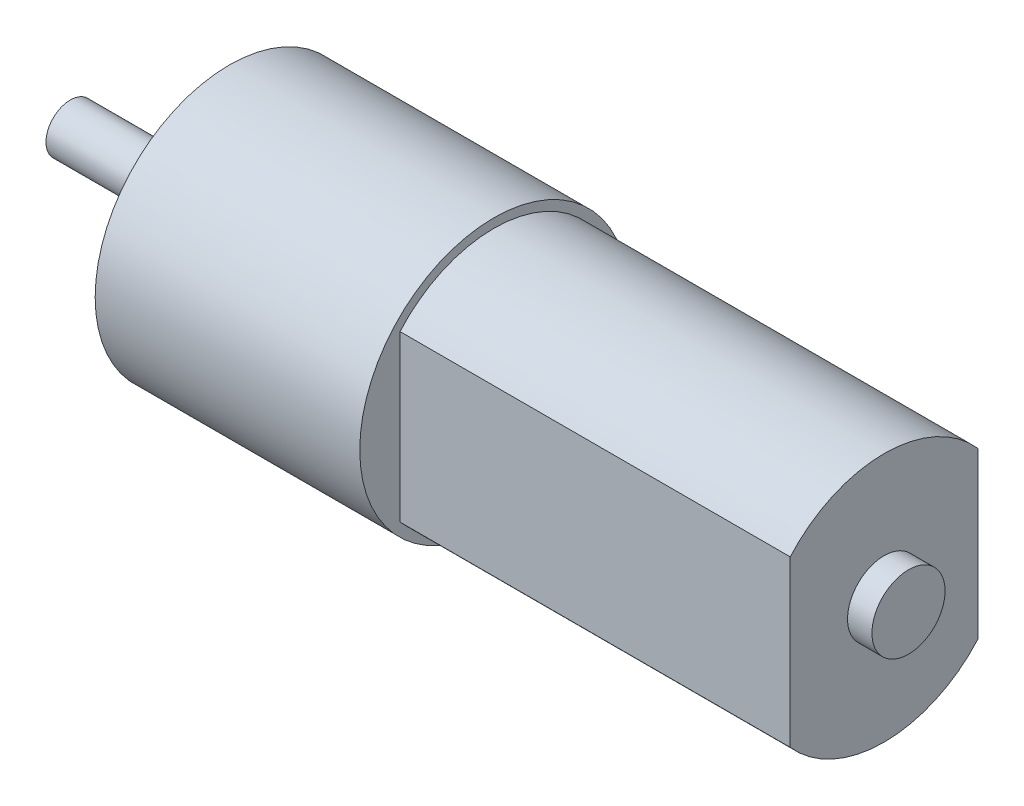
ISO-10303-21;
HEADER;
FILE_DESCRIPTION(('STEP AP214'),'2;1');
FILE_NAME('part.step','',(''),(''),'','','');
FILE_SCHEMA(('AUTOMOTIVE_DESIGN { 1 0 10303 214 1 1 1 1 }'));
ENDSEC;
DATA;
#1=APPLICATION_CONTEXT('core data for automotive mechanical design processes');
#2=APPLICATION_PROTOCOL_DEFINITION('international standard','automotive_design',2000,#1);
#3=PRODUCT_CONTEXT('',#1,'mechanical');
#4=PRODUCT('Part','Part','',(#3));
#5=PRODUCT_RELATED_PRODUCT_CATEGORY('part','',(#4));
#6=PRODUCT_DEFINITION_FORMATION('','',#4);
#7=PRODUCT_DEFINITION_CONTEXT('part definition',#1,'design');
#8=PRODUCT_DEFINITION('design','',#6,#7);
#9=PRODUCT_DEFINITION_SHAPE('','',#8);
#10=(LENGTH_UNIT() NAMED_UNIT(*) SI_UNIT(.MILLI.,.METRE.));
#11=(NAMED_UNIT(*) PLANE_ANGLE_UNIT() SI_UNIT($,.RADIAN.));
#12=(NAMED_UNIT(*) SI_UNIT($,.STERADIAN.) SOLID_ANGLE_UNIT());
#13=UNCERTAINTY_MEASURE_WITH_UNIT(LENGTH_MEASURE(1.E-05),#10,'distance_accuracy_value','');
#14=(GEOMETRIC_REPRESENTATION_CONTEXT(3) GLOBAL_UNCERTAINTY_ASSIGNED_CONTEXT((#13)) GLOBAL_UNIT_ASSIGNED_CONTEXT((#10,
#11,#12)) REPRESENTATION_CONTEXT('',''));
#15=CARTESIAN_POINT('',(0.,0.,0.));
#16=DIRECTION('',(0.,0.,1.));
#17=DIRECTION('',(1.,0.,0.));
#18=AXIS2_PLACEMENT_3D('',#15,#16,#17);
#19=CARTESIAN_POINT('',(38.7033994714384,0.,0.));
#20=DIRECTION('',(1.,0.,0.));
#21=DIRECTION('',(0.,0.,-1.));
#22=AXIS2_PLACEMENT_3D('',#19,#20,#21);
#23=CYLINDRICAL_SURFACE('',#22,7.00000000000001);
#24=CARTESIAN_POINT('',(-2.,0.,0.));
#25=DIRECTION('',(1.,0.,0.));
#26=DIRECTION('',(0.,0.,-1.));
#27=AXIS2_PLACEMENT_3D('',#24,#25,#26);
#28=CIRCLE('',#27,7.00000000000001);
#29=CARTESIAN_POINT('',(-2.,1.69313093032285,6.79215044391569));
#30=VERTEX_POINT('',#29);
#31=CARTESIAN_POINT('',(-2.,-6.79215044391568,-1.69313093032292));
#32=VERTEX_POINT('',#31);
#33=EDGE_CURVE('E119',#30,#32,#28,.T.);
#34=ORIENTED_EDGE('',*,*,#33,.T.);
#35=DIRECTION('',(-1.,0.,0.));
#36=VECTOR('',#35,1.);
#37=CARTESIAN_POINT('',(7.211102550928,-6.79215044391568,-1.69313093032292));
#38=LINE('',#37,#36);
#39=CARTESIAN_POINT('',(0.,-6.79215044391568,-1.69313093032292));
#40=VERTEX_POINT('',#39);
#41=EDGE_CURVE('E101',#40,#32,#38,.T.);
#42=ORIENTED_EDGE('',*,*,#41,.F.);
#43=CARTESIAN_POINT('',(0.,0.,0.));
#44=DIRECTION('',(1.,0.,0.));
#45=DIRECTION('',(0.,0.,-1.));
#46=AXIS2_PLACEMENT_3D('',#43,#44,#45);
#47=CIRCLE('',#46,7.00000000000001);
#48=CARTESIAN_POINT('',(0.,1.69313093032285,6.79215044391569));
#49=VERTEX_POINT('',#48);
#50=EDGE_CURVE('E120',#49,#40,#47,.T.);
#51=ORIENTED_EDGE('',*,*,#50,.F.);
#52=DIRECTION('',(-1.,0.,0.));
#53=VECTOR('',#52,1.);
#54=CARTESIAN_POINT('',(7.211102550928,1.69313093032285,6.79215044391569));
#55=LINE('',#54,#53);
#56=EDGE_CURVE('E175',#49,#30,#55,.T.);
#57=ORIENTED_EDGE('',*,*,#56,.T.);
#58=EDGE_LOOP('',(#34,#42,#51,#57));
#59=FACE_BOUND('',#58,.T.);
#60=ADVANCED_FACE('F32',(#59),#23,.T.);
#61=CARTESIAN_POINT('',(38.7033994714384,0.,0.));
#62=DIRECTION('',(1.,0.,0.));
#63=DIRECTION('',(0.,0.,-1.));
#64=AXIS2_PLACEMENT_3D('',#61,#62,#63);
#65=CYLINDRICAL_SURFACE('',#64,10.25);
#66=CARTESIAN_POINT('',(21.7,0.,0.));
#67=DIRECTION('',(1.,0.,0.));
#68=DIRECTION('',(0.,0.,-1.));
#69=AXIS2_PLACEMENT_3D('',#66,#67,#68);
#70=CIRCLE('',#69,10.25);
#71=CARTESIAN_POINT('',(21.7,-6.76553767264656,7.7));
#72=VERTEX_POINT('',#71);
#73=CARTESIAN_POINT('',(21.7,-6.76553767264656,-7.7));
#74=VERTEX_POINT('',#73);
#75=EDGE_CURVE('E158',#72,#74,#70,.T.);
#76=ORIENTED_EDGE('',*,*,#75,.T.);
#77=DIRECTION('',(1.,0.,0.));
#78=VECTOR('',#77,1.);
#79=CARTESIAN_POINT('',(38.7033994714384,-6.76553767264656,-7.7));
#80=LINE('',#79,#78);
#81=CARTESIAN_POINT('',(53.7,-6.76553767264656,-7.7));
#82=VERTEX_POINT('',#81);
#83=EDGE_CURVE('E155',#74,#82,#80,.T.);
#84=ORIENTED_EDGE('',*,*,#83,.T.);
#85=CARTESIAN_POINT('',(53.7,0.,0.));
#86=DIRECTION('',(1.,0.,0.));
#87=DIRECTION('',(0.,0.,-1.));
#88=AXIS2_PLACEMENT_3D('',#85,#86,#87);
#89=CIRCLE('',#88,10.25);
#90=CARTESIAN_POINT('',(53.7,-6.76553767264656,7.7));
#91=VERTEX_POINT('',#90);
#92=EDGE_CURVE('E142',#91,#82,#89,.T.);
#93=ORIENTED_EDGE('',*,*,#92,.F.);
#94=DIRECTION('',(1.,0.,0.));
#95=VECTOR('',#94,1.);
#96=CARTESIAN_POINT('',(38.7033994714384,-6.76553767264656,7.7));
#97=LINE('',#96,#95);
#98=EDGE_CURVE('E153',#91,#72,#97,.F.);
#99=ORIENTED_EDGE('',*,*,#98,.T.);
#100=EDGE_LOOP('',(#76,#84,#93,#99));
#101=FACE_BOUND('',#100,.T.);
#102=ADVANCED_FACE('F152',(#101),#65,.T.);
#103=CARTESIAN_POINT('',(-13.035736804533,0.,0.));
#104=DIRECTION('',(1.,0.,0.));
#105=DIRECTION('',(0.,0.,-1.));
#106=AXIS2_PLACEMENT_3D('',#103,#104,#105);
#107=PLANE('',#106);
#108=CARTESIAN_POINT('',(-13.035736804533,0.,0.));
#109=DIRECTION('',(1.,0.,0.));
#110=DIRECTION('',(0.,0.,-1.));
#111=AXIS2_PLACEMENT_3D('',#108,#109,#110);
#112=CIRCLE('',#111,2.00000000000001);
#113=CARTESIAN_POINT('',(-13.035736804533,0.,-2.00000000000001));
#114=VERTEX_POINT('',#113);
#115=EDGE_CURVE('E134',#114,#114,#112,.T.);
#116=ORIENTED_EDGE('',*,*,#115,.F.);
#117=EDGE_LOOP('',(#116));
#118=FACE_BOUND('',#117,.T.);
#119=ADVANCED_FACE('F34',(#118),#107,.F.);
#120=CARTESIAN_POINT('',(38.7033994714384,0.,0.));
#121=DIRECTION('',(1.,0.,0.));
#122=DIRECTION('',(0.,0.,-1.));
#123=AXIS2_PLACEMENT_3D('',#120,#121,#122);
#124=CYLINDRICAL_SURFACE('',#123,2.00000000000001);
#125=CARTESIAN_POINT('',(-3.,0.,0.));
#126=DIRECTION('',(1.,0.,0.));
#127=DIRECTION('',(0.,0.,-1.));
#128=AXIS2_PLACEMENT_3D('',#125,#126,#127);
#129=CIRCLE('',#128,2.00000000000001);
#130=CARTESIAN_POINT('',(-3.,0.,-2.00000000000001));
#131=VERTEX_POINT('',#130);
#132=EDGE_CURVE('E131',#131,#131,#129,.T.);
#133=ORIENTED_EDGE('',*,*,#132,.F.);
#134=EDGE_LOOP('',(#133));
#135=FACE_BOUND('',#134,.T.);
#136=ORIENTED_EDGE('',*,*,#115,.T.);
#137=EDGE_LOOP('',(#136));
#138=FACE_BOUND('',#137,.T.);
#139=ADVANCED_FACE('F239',(#135,#138),#124,.T.);
#140=CARTESIAN_POINT('',(-3.,-2.00000000000001,0.));
#141=DIRECTION('',(1.,0.,0.));
#142=DIRECTION('',(0.,0.,-1.));
#143=AXIS2_PLACEMENT_3D('',#140,#141,#142);
#144=PLANE('',#143);
#145=CARTESIAN_POINT('',(-3.,0.,0.));
#146=DIRECTION('',(1.,0.,0.));
#147=DIRECTION('',(0.,0.,-1.));
#148=AXIS2_PLACEMENT_3D('',#145,#146,#147);
#149=CIRCLE('',#148,4.00000000000001);
#150=CARTESIAN_POINT('',(-3.,0.,-4.00000000000001));
#151=VERTEX_POINT('',#150);
#152=EDGE_CURVE('E128',#151,#151,#149,.T.);
#153=ORIENTED_EDGE('',*,*,#152,.F.);
#154=EDGE_LOOP('',(#153));
#155=FACE_BOUND('',#154,.T.);
#156=ORIENTED_EDGE('',*,*,#132,.T.);
#157=EDGE_LOOP('',(#156));
#158=FACE_BOUND('',#157,.T.);
#159=ADVANCED_FACE('F234',(#155,#158),#144,.F.);
#160=CARTESIAN_POINT('',(38.7033994714384,0.,0.));
#161=DIRECTION('',(1.,0.,0.));
#162=DIRECTION('',(0.,0.,-1.));
#163=AXIS2_PLACEMENT_3D('',#160,#161,#162);
#164=CYLINDRICAL_SURFACE('',#163,4.00000000000001);
#165=CARTESIAN_POINT('',(-2.,0.,0.));
#166=DIRECTION('',(1.,0.,0.));
#167=DIRECTION('',(0.,0.,-1.));
#168=AXIS2_PLACEMENT_3D('',#165,#166,#167);
#169=CIRCLE('',#168,4.00000000000001);
#170=CARTESIAN_POINT('',(-2.,0.,-4.00000000000001));
#171=VERTEX_POINT('',#170);
#172=EDGE_CURVE('E122',#171,#171,#169,.T.);
#173=ORIENTED_EDGE('',*,*,#172,.F.);
#174=EDGE_LOOP('',(#173));
#175=FACE_BOUND('',#174,.T.);
#176=ORIENTED_EDGE('',*,*,#152,.T.);
#177=EDGE_LOOP('',(#176));
#178=FACE_BOUND('',#177,.T.);
#179=ADVANCED_FACE('F230',(#175,#178),#164,.T.);
#180=CARTESIAN_POINT('',(-2.,-4.00000000000001,0.));
#181=DIRECTION('',(1.,0.,0.));
#182=DIRECTION('',(0.,0.,-1.));
#183=AXIS2_PLACEMENT_3D('',#180,#181,#182);
#184=PLANE('',#183);
#185=CARTESIAN_POINT('',(-2.,-1.69313093032285,-6.79215044391569));
#186=VERTEX_POINT('',#185);
#187=CARTESIAN_POINT('',(-2.,6.79215044391567,1.69313093032292));
#188=VERTEX_POINT('',#187);
#189=EDGE_CURVE('E111',#186,#188,#28,.T.);
#190=ORIENTED_EDGE('',*,*,#189,.F.);
#191=DIRECTION('',(0.,0.707106781186551,-0.707106781186544));
#192=VECTOR('',#191,1.);
#193=CARTESIAN_POINT('',(-2.,-1.69313093032285,-6.79215044391569));
#194=LINE('',#193,#192);
#195=EDGE_CURVE('E95',#32,#186,#194,.T.);
#196=ORIENTED_EDGE('',*,*,#195,.F.);
#197=ORIENTED_EDGE('',*,*,#33,.F.);
#198=DIRECTION('',(0.,-0.707106781186551,0.707106781186544));
#199=VECTOR('',#198,1.);
#200=CARTESIAN_POINT('',(-2.,1.69313093032285,6.79215044391569));
#201=LINE('',#200,#199);
#202=EDGE_CURVE('E118',#188,#30,#201,.T.);
#203=ORIENTED_EDGE('',*,*,#202,.F.);
#204=EDGE_LOOP('',(#190,#196,#197,#203));
#205=FACE_BOUND('',#204,.T.);
#206=ORIENTED_EDGE('',*,*,#172,.T.);
#207=EDGE_LOOP('',(#206));
#208=FACE_BOUND('',#207,.T.);
#209=ADVANCED_FACE('F116',(#205,#208),#184,.F.);
#210=CARTESIAN_POINT('',(0.,-1.69313093032285,-6.79215044391569));
#211=VERTEX_POINT('',#210);
#212=CARTESIAN_POINT('',(0.,6.79215044391567,1.69313093032292));
#213=VERTEX_POINT('',#212);
#214=EDGE_CURVE('E113',#211,#213,#47,.T.);
#215=ORIENTED_EDGE('',*,*,#214,.F.);
#216=DIRECTION('',(-1.,0.,0.));
#217=VECTOR('',#216,1.);
#218=CARTESIAN_POINT('',(7.211102550928,-1.69313093032285,-6.79215044391569));
#219=LINE('',#218,#217);
#220=EDGE_CURVE('E98',#211,#186,#219,.T.);
#221=ORIENTED_EDGE('',*,*,#220,.T.);
#222=ORIENTED_EDGE('',*,*,#189,.T.);
#223=DIRECTION('',(-1.,0.,0.));
#224=VECTOR('',#223,1.);
#225=CARTESIAN_POINT('',(7.211102550928,6.79215044391567,1.69313093032292));
#226=LINE('',#225,#224);
#227=EDGE_CURVE('E173',#213,#188,#226,.T.);
#228=ORIENTED_EDGE('',*,*,#227,.F.);
#229=EDGE_LOOP('',(#215,#221,#222,#228));
#230=FACE_BOUND('',#229,.T.);
#231=ADVANCED_FACE('F109',(#230),#23,.T.);
#232=CARTESIAN_POINT('',(0.,-7.00000000000001,0.));
#233=DIRECTION('',(1.,0.,0.));
#234=DIRECTION('',(0.,0.,-1.));
#235=AXIS2_PLACEMENT_3D('',#232,#233,#234);
#236=PLANE('',#235);
#237=CARTESIAN_POINT('',(0.,0.,-9.));
#238=DIRECTION('',(-1.,0.,0.));
#239=DIRECTION('',(0.,0.,1.));
#240=AXIS2_PLACEMENT_3D('',#237,#238,#239);
#241=CIRCLE('',#240,1.);
#242=CARTESIAN_POINT('',(0.,0.,-8.));
#243=VERTEX_POINT('',#242);
#244=EDGE_CURVE('E460',#243,#243,#241,.T.);
#245=ORIENTED_EDGE('',*,*,#244,.F.);
#246=EDGE_LOOP('',(#245));
#247=FACE_BOUND('',#246,.T.);
#248=CARTESIAN_POINT('',(0.,-9.,0.));
#249=DIRECTION('',(-1.,0.,0.));
#250=DIRECTION('',(0.,0.,1.));
#251=AXIS2_PLACEMENT_3D('',#248,#249,#250);
#252=CIRCLE('',#251,1.);
#253=CARTESIAN_POINT('',(0.,-9.,1.));
#254=VERTEX_POINT('',#253);
#255=EDGE_CURVE('E470',#254,#254,#252,.T.);
#256=ORIENTED_EDGE('',*,*,#255,.F.);
#257=EDGE_LOOP('',(#256));
#258=FACE_BOUND('',#257,.T.);
#259=CARTESIAN_POINT('',(0.,0.,9.));
#260=DIRECTION('',(-1.,0.,0.));
#261=DIRECTION('',(0.,0.,1.));
#262=AXIS2_PLACEMENT_3D('',#259,#260,#261);
#263=CIRCLE('',#262,1.);
#264=CARTESIAN_POINT('',(0.,0.,10.));
#265=VERTEX_POINT('',#264);
#266=EDGE_CURVE('E476',#265,#265,#263,.T.);
#267=ORIENTED_EDGE('',*,*,#266,.F.);
#268=EDGE_LOOP('',(#267));
#269=FACE_BOUND('',#268,.T.);
#270=CARTESIAN_POINT('',(0.,9.,0.));
#271=DIRECTION('',(-1.,0.,0.));
#272=DIRECTION('',(0.,0.,1.));
#273=AXIS2_PLACEMENT_3D('',#270,#271,#272);
#274=CIRCLE('',#273,1.);
#275=CARTESIAN_POINT('',(0.,9.,1.));
#276=VERTEX_POINT('',#275);
#277=EDGE_CURVE('E459',#276,#276,#274,.T.);
#278=ORIENTED_EDGE('',*,*,#277,.F.);
#279=EDGE_LOOP('',(#278));
#280=FACE_BOUND('',#279,.T.);
#281=CARTESIAN_POINT('',(0.,0.,0.));
#282=DIRECTION('',(1.,0.,0.));
#283=DIRECTION('',(0.,0.,-1.));
#284=AXIS2_PLACEMENT_3D('',#281,#282,#283);
#285=CIRCLE('',#284,11.);
#286=CARTESIAN_POINT('',(0.,0.,-11.));
#287=VERTEX_POINT('',#286);
#288=EDGE_CURVE('E166',#287,#287,#285,.T.);
#289=ORIENTED_EDGE('',*,*,#288,.F.);
#290=EDGE_LOOP('',(#289));
#291=FACE_BOUND('',#290,.T.);
#292=ORIENTED_EDGE('',*,*,#50,.T.);
#293=DIRECTION('',(0.,0.707106781186551,-0.707106781186544));
#294=VECTOR('',#293,1.);
#295=CARTESIAN_POINT('',(0.,-1.69313093032285,-6.79215044391569));
#296=LINE('',#295,#294);
#297=EDGE_CURVE('E47',#40,#211,#296,.T.);
#298=ORIENTED_EDGE('',*,*,#297,.T.);
#299=ORIENTED_EDGE('',*,*,#214,.T.);
#300=DIRECTION('',(0.,-0.707106781186551,0.707106781186544));
#301=VECTOR('',#300,1.);
#302=CARTESIAN_POINT('',(0.,1.69313093032285,6.79215044391569));
#303=LINE('',#302,#301);
#304=EDGE_CURVE('E52',#213,#49,#303,.T.);
#305=ORIENTED_EDGE('',*,*,#304,.T.);
#306=EDGE_LOOP('',(#292,#298,#299,#305));
#307=FACE_BOUND('',#306,.T.);
#308=ADVANCED_FACE('F170',(#247,#258,#269,#280,#291,#307),#236,.F.);
#309=CARTESIAN_POINT('',(38.7033994714384,0.,0.));
#310=DIRECTION('',(1.,0.,0.));
#311=DIRECTION('',(0.,0.,-1.));
#312=AXIS2_PLACEMENT_3D('',#309,#310,#311);
#313=CYLINDRICAL_SURFACE('',#312,11.);
#314=CARTESIAN_POINT('',(21.7,0.,0.));
#315=DIRECTION('',(1.,0.,0.));
#316=DIRECTION('',(0.,0.,-1.));
#317=AXIS2_PLACEMENT_3D('',#314,#315,#316);
#318=CIRCLE('',#317,11.);
#319=CARTESIAN_POINT('',(21.7,0.,-11.));
#320=VERTEX_POINT('',#319);
#321=EDGE_CURVE('E164',#320,#320,#318,.T.);
#322=ORIENTED_EDGE('',*,*,#321,.F.);
#323=EDGE_LOOP('',(#322));
#324=FACE_BOUND('',#323,.T.);
#325=ORIENTED_EDGE('',*,*,#288,.T.);
#326=EDGE_LOOP('',(#325));
#327=FACE_BOUND('',#326,.T.);
#328=ADVANCED_FACE('F228',(#324,#327),#313,.T.);
#329=CARTESIAN_POINT('',(21.7,-11.,0.));
#330=DIRECTION('',(-1.,0.,0.));
#331=DIRECTION('',(0.,0.,1.));
#332=AXIS2_PLACEMENT_3D('',#329,#330,#331);
#333=PLANE('',#332);
#334=DIRECTION('',(0.,-1.,0.));
#335=VECTOR('',#334,1.);
#336=CARTESIAN_POINT('',(21.7,-12.1760425529863,-7.7));
#337=LINE('',#336,#335);
#338=CARTESIAN_POINT('',(21.7,6.76553767264656,-7.7));
#339=VERTEX_POINT('',#338);
#340=EDGE_CURVE('E178',#339,#74,#337,.T.);
#341=ORIENTED_EDGE('',*,*,#340,.T.);
#342=ORIENTED_EDGE('',*,*,#75,.F.);
#343=DIRECTION('',(0.,1.,0.));
#344=VECTOR('',#343,1.);
#345=CARTESIAN_POINT('',(21.7,11.1958328380294,7.7));
#346=LINE('',#345,#344);
#347=CARTESIAN_POINT('',(21.7,6.76553767264656,7.7));
#348=VERTEX_POINT('',#347);
#349=EDGE_CURVE('E188',#72,#348,#346,.T.);
#350=ORIENTED_EDGE('',*,*,#349,.T.);
#351=EDGE_CURVE('E156',#339,#348,#70,.T.);
#352=ORIENTED_EDGE('',*,*,#351,.F.);
#353=EDGE_LOOP('',(#341,#342,#350,#352));
#354=FACE_BOUND('',#353,.T.);
#355=ORIENTED_EDGE('',*,*,#321,.T.);
#356=EDGE_LOOP('',(#355));
#357=FACE_BOUND('',#356,.T.);
#358=ADVANCED_FACE('F212',(#354,#357),#333,.F.);
#359=CARTESIAN_POINT('',(53.7,6.76553767264656,-7.7));
#360=VERTEX_POINT('',#359);
#361=CARTESIAN_POINT('',(53.7,6.76553767264656,7.7));
#362=VERTEX_POINT('',#361);
#363=EDGE_CURVE('E144',#360,#362,#89,.T.);
#364=ORIENTED_EDGE('',*,*,#363,.F.);
#365=DIRECTION('',(1.,0.,0.));
#366=VECTOR('',#365,1.);
#367=CARTESIAN_POINT('',(38.7033994714384,6.76553767264656,-7.7));
#368=LINE('',#367,#366);
#369=EDGE_CURVE('E181',#360,#339,#368,.F.);
#370=ORIENTED_EDGE('',*,*,#369,.T.);
#371=ORIENTED_EDGE('',*,*,#351,.T.);
#372=DIRECTION('',(1.,0.,0.));
#373=VECTOR('',#372,1.);
#374=CARTESIAN_POINT('',(38.7033994714384,6.76553767264656,7.7));
#375=LINE('',#374,#373);
#376=EDGE_CURVE('E192',#348,#362,#375,.T.);
#377=ORIENTED_EDGE('',*,*,#376,.T.);
#378=EDGE_LOOP('',(#364,#370,#371,#377));
#379=FACE_BOUND('',#378,.T.);
#380=ADVANCED_FACE('F203',(#379),#65,.T.);
#381=CARTESIAN_POINT('',(53.7,-10.25,0.));
#382=DIRECTION('',(-1.,0.,0.));
#383=DIRECTION('',(0.,0.,1.));
#384=AXIS2_PLACEMENT_3D('',#381,#382,#383);
#385=PLANE('',#384);
#386=CARTESIAN_POINT('',(53.7,0.,0.));
#387=DIRECTION('',(1.,0.,0.));
#388=DIRECTION('',(0.,0.,-1.));
#389=AXIS2_PLACEMENT_3D('',#386,#387,#388);
#390=CIRCLE('',#389,3.);
#391=CARTESIAN_POINT('',(53.7,0.,-3.));
#392=VERTEX_POINT('',#391);
#393=EDGE_CURVE('E160',#392,#392,#390,.T.);
#394=ORIENTED_EDGE('',*,*,#393,.F.);
#395=EDGE_LOOP('',(#394));
#396=FACE_BOUND('',#395,.T.);
#397=ORIENTED_EDGE('',*,*,#92,.T.);
#398=DIRECTION('',(0.,1.,0.));
#399=VECTOR('',#398,1.);
#400=CARTESIAN_POINT('',(53.7,-10.25,-7.7));
#401=LINE('',#400,#399);
#402=EDGE_CURVE('E11',#82,#360,#401,.T.);
#403=ORIENTED_EDGE('',*,*,#402,.T.);
#404=ORIENTED_EDGE('',*,*,#363,.T.);
#405=DIRECTION('',(0.,-1.,0.));
#406=VECTOR('',#405,1.);
#407=CARTESIAN_POINT('',(53.7,-10.25,7.7));
#408=LINE('',#407,#406);
#409=EDGE_CURVE('E40',#362,#91,#408,.T.);
#410=ORIENTED_EDGE('',*,*,#409,.T.);
#411=EDGE_LOOP('',(#397,#403,#404,#410));
#412=FACE_BOUND('',#411,.T.);
#413=ADVANCED_FACE('F141',(#396,#412),#385,.F.);
#414=CARTESIAN_POINT('',(38.7033994714384,0.,0.));
#415=DIRECTION('',(1.,0.,0.));
#416=DIRECTION('',(0.,0.,-1.));
#417=AXIS2_PLACEMENT_3D('',#414,#415,#416);
#418=CYLINDRICAL_SURFACE('',#417,3.);
#419=CARTESIAN_POINT('',(55.7,0.,0.));
#420=DIRECTION('',(1.,0.,0.));
#421=DIRECTION('',(0.,0.,-1.));
#422=AXIS2_PLACEMENT_3D('',#419,#420,#421);
#423=CIRCLE('',#422,2.99999999999999);
#424=CARTESIAN_POINT('',(55.7,0.,-2.99999999999999));
#425=VERTEX_POINT('',#424);
#426=EDGE_CURVE('E193',#425,#425,#423,.T.);
#427=ORIENTED_EDGE('',*,*,#426,.F.);
#428=EDGE_LOOP('',(#427));
#429=FACE_BOUND('',#428,.T.);
#430=ORIENTED_EDGE('',*,*,#393,.T.);
#431=EDGE_LOOP('',(#430));
#432=FACE_BOUND('',#431,.T.);
#433=ADVANCED_FACE('F200',(#429,#432),#418,.T.);
#434=CARTESIAN_POINT('',(55.7,-2.99999999999999,0.));
#435=DIRECTION('',(-1.,0.,0.));
#436=DIRECTION('',(0.,0.,1.));
#437=AXIS2_PLACEMENT_3D('',#434,#435,#436);
#438=PLANE('',#437);
#439=ORIENTED_EDGE('',*,*,#426,.T.);
#440=EDGE_LOOP('',(#439));
#441=FACE_BOUND('',#440,.T.);
#442=ADVANCED_FACE('F209',(#441),#438,.F.);
#443=CARTESIAN_POINT('',(-3.10870801683364,11.1958328380294,7.7));
#444=DIRECTION('',(0.,0.,-1.));
#445=DIRECTION('',(0.,1.,0.));
#446=AXIS2_PLACEMENT_3D('',#443,#444,#445);
#447=PLANE('',#446);
#448=ORIENTED_EDGE('',*,*,#349,.F.);
#449=ORIENTED_EDGE('',*,*,#98,.F.);
#450=ORIENTED_EDGE('',*,*,#409,.F.);
#451=ORIENTED_EDGE('',*,*,#376,.F.);
#452=EDGE_LOOP('',(#448,#449,#450,#451));
#453=FACE_BOUND('',#452,.T.);
#454=ADVANCED_FACE('F299',(#453),#447,.F.);
#455=CARTESIAN_POINT('',(-3.10870801683364,-12.1760425529863,-7.7));
#456=DIRECTION('',(0.,0.,1.));
#457=DIRECTION('',(0.,-1.,0.));
#458=AXIS2_PLACEMENT_3D('',#455,#456,#457);
#459=PLANE('',#458);
#460=ORIENTED_EDGE('',*,*,#340,.F.);
#461=ORIENTED_EDGE('',*,*,#369,.F.);
#462=ORIENTED_EDGE('',*,*,#402,.F.);
#463=ORIENTED_EDGE('',*,*,#83,.F.);
#464=EDGE_LOOP('',(#460,#461,#462,#463));
#465=FACE_BOUND('',#464,.T.);
#466=ADVANCED_FACE('F303',(#465),#459,.F.);
#467=CARTESIAN_POINT('',(7.211102550928,1.69313093032285,6.79215044391569));
#468=DIRECTION('',(0.,-0.707106781186544,-0.707106781186551));
#469=DIRECTION('',(0.,0.707106781186551,-0.707106781186544));
#470=AXIS2_PLACEMENT_3D('',#467,#468,#469);
#471=PLANE('',#470);
#472=ORIENTED_EDGE('',*,*,#227,.T.);
#473=ORIENTED_EDGE('',*,*,#202,.T.);
#474=ORIENTED_EDGE('',*,*,#56,.F.);
#475=ORIENTED_EDGE('',*,*,#304,.F.);
#476=EDGE_LOOP('',(#472,#473,#474,#475));
#477=FACE_BOUND('',#476,.T.);
#478=ADVANCED_FACE('F172',(#477),#471,.F.);
#479=CARTESIAN_POINT('',(7.211102550928,-1.69313093032285,-6.79215044391569));
#480=DIRECTION('',(0.,0.707106781186544,0.707106781186551));
#481=DIRECTION('',(0.,-0.707106781186551,0.707106781186544));
#482=AXIS2_PLACEMENT_3D('',#479,#480,#481);
#483=PLANE('',#482);
#484=ORIENTED_EDGE('',*,*,#41,.T.);
#485=ORIENTED_EDGE('',*,*,#195,.T.);
#486=ORIENTED_EDGE('',*,*,#220,.F.);
#487=ORIENTED_EDGE('',*,*,#297,.F.);
#488=EDGE_LOOP('',(#484,#485,#486,#487));
#489=FACE_BOUND('',#488,.T.);
#490=ADVANCED_FACE('F97',(#489),#483,.F.);
#491=CARTESIAN_POINT('',(4.,9.,0.));
#492=DIRECTION('',(-1.,0.,0.));
#493=DIRECTION('',(0.,0.,1.));
#494=AXIS2_PLACEMENT_3D('',#491,#492,#493);
#495=CYLINDRICAL_SURFACE('',#494,1.);
#496=CARTESIAN_POINT('',(4.,9.,0.));
#497=DIRECTION('',(-1.,0.,0.));
#498=DIRECTION('',(0.,0.,1.));
#499=AXIS2_PLACEMENT_3D('',#496,#497,#498);
#500=CIRCLE('',#499,1.);
#501=CARTESIAN_POINT('',(4.,9.,1.));
#502=VERTEX_POINT('',#501);
#503=EDGE_CURVE('E106',#502,#502,#500,.T.);
#504=ORIENTED_EDGE('',*,*,#503,.F.);
#505=EDGE_LOOP('',(#504));
#506=FACE_BOUND('',#505,.T.);
#507=ORIENTED_EDGE('',*,*,#277,.T.);
#508=EDGE_LOOP('',(#507));
#509=FACE_BOUND('',#508,.T.);
#510=ADVANCED_FACE('F343',(#506,#509),#495,.F.);
#511=CARTESIAN_POINT('',(4.,9.,0.));
#512=DIRECTION('',(-1.,0.,0.));
#513=DIRECTION('',(0.,0.,1.));
#514=AXIS2_PLACEMENT_3D('',#511,#512,#513);
#515=PLANE('',#514);
#516=ORIENTED_EDGE('',*,*,#503,.T.);
#517=EDGE_LOOP('',(#516));
#518=FACE_BOUND('',#517,.T.);
#519=ADVANCED_FACE('F357',(#518),#515,.T.);
#520=CARTESIAN_POINT('',(4.,0.,9.));
#521=DIRECTION('',(-1.,0.,0.));
#522=DIRECTION('',(0.,0.,1.));
#523=AXIS2_PLACEMENT_3D('',#520,#521,#522);
#524=CYLINDRICAL_SURFACE('',#523,1.);
#525=CARTESIAN_POINT('',(4.,0.,9.));
#526=DIRECTION('',(-1.,0.,0.));
#527=DIRECTION('',(0.,0.,1.));
#528=AXIS2_PLACEMENT_3D('',#525,#526,#527);
#529=CIRCLE('',#528,1.);
#530=CARTESIAN_POINT('',(4.,0.,10.));
#531=VERTEX_POINT('',#530);
#532=EDGE_CURVE('E473',#531,#531,#529,.T.);
#533=ORIENTED_EDGE('',*,*,#532,.F.);
#534=EDGE_LOOP('',(#533));
#535=FACE_BOUND('',#534,.T.);
#536=ORIENTED_EDGE('',*,*,#266,.T.);
#537=EDGE_LOOP('',(#536));
#538=FACE_BOUND('',#537,.T.);
#539=ADVANCED_FACE('F367',(#535,#538),#524,.F.);
#540=CARTESIAN_POINT('',(4.,0.,9.));
#541=DIRECTION('',(-1.,0.,0.));
#542=DIRECTION('',(0.,0.,1.));
#543=AXIS2_PLACEMENT_3D('',#540,#541,#542);
#544=PLANE('',#543);
#545=ORIENTED_EDGE('',*,*,#532,.T.);
#546=EDGE_LOOP('',(#545));
#547=FACE_BOUND('',#546,.T.);
#548=ADVANCED_FACE('F377',(#547),#544,.T.);
#549=CARTESIAN_POINT('',(4.,-9.,0.));
#550=DIRECTION('',(-1.,0.,0.));
#551=DIRECTION('',(0.,0.,1.));
#552=AXIS2_PLACEMENT_3D('',#549,#550,#551);
#553=CYLINDRICAL_SURFACE('',#552,1.);
#554=CARTESIAN_POINT('',(4.,-9.,0.));
#555=DIRECTION('',(-1.,0.,0.));
#556=DIRECTION('',(0.,0.,1.));
#557=AXIS2_PLACEMENT_3D('',#554,#555,#556);
#558=CIRCLE('',#557,1.);
#559=CARTESIAN_POINT('',(4.,-9.,1.));
#560=VERTEX_POINT('',#559);
#561=EDGE_CURVE('E465',#560,#560,#558,.T.);
#562=ORIENTED_EDGE('',*,*,#561,.F.);
#563=EDGE_LOOP('',(#562));
#564=FACE_BOUND('',#563,.T.);
#565=ORIENTED_EDGE('',*,*,#255,.T.);
#566=EDGE_LOOP('',(#565));
#567=FACE_BOUND('',#566,.T.);
#568=ADVANCED_FACE('F387',(#564,#567),#553,.F.);
#569=CARTESIAN_POINT('',(4.,-9.,0.));
#570=DIRECTION('',(-1.,0.,0.));
#571=DIRECTION('',(0.,0.,1.));
#572=AXIS2_PLACEMENT_3D('',#569,#570,#571);
#573=PLANE('',#572);
#574=ORIENTED_EDGE('',*,*,#561,.T.);
#575=EDGE_LOOP('',(#574));
#576=FACE_BOUND('',#575,.T.);
#577=ADVANCED_FACE('F397',(#576),#573,.T.);
#578=CARTESIAN_POINT('',(4.,0.,-9.));
#579=DIRECTION('',(-1.,0.,0.));
#580=DIRECTION('',(0.,0.,1.));
#581=AXIS2_PLACEMENT_3D('',#578,#579,#580);
#582=CYLINDRICAL_SURFACE('',#581,1.);
#583=CARTESIAN_POINT('',(4.,0.,-9.));
#584=DIRECTION('',(-1.,0.,0.));
#585=DIRECTION('',(0.,0.,1.));
#586=AXIS2_PLACEMENT_3D('',#583,#584,#585);
#587=CIRCLE('',#586,1.);
#588=CARTESIAN_POINT('',(4.,0.,-8.));
#589=VERTEX_POINT('',#588);
#590=EDGE_CURVE('E458',#589,#589,#587,.T.);
#591=ORIENTED_EDGE('',*,*,#590,.F.);
#592=EDGE_LOOP('',(#591));
#593=FACE_BOUND('',#592,.T.);
#594=ORIENTED_EDGE('',*,*,#244,.T.);
#595=EDGE_LOOP('',(#594));
#596=FACE_BOUND('',#595,.T.);
#597=ADVANCED_FACE('F407',(#593,#596),#582,.F.);
#598=CARTESIAN_POINT('',(4.,0.,-9.));
#599=DIRECTION('',(-1.,0.,0.));
#600=DIRECTION('',(0.,0.,1.));
#601=AXIS2_PLACEMENT_3D('',#598,#599,#600);
#602=PLANE('',#601);
#603=ORIENTED_EDGE('',*,*,#590,.T.);
#604=EDGE_LOOP('',(#603));
#605=FACE_BOUND('',#604,.T.);
#606=ADVANCED_FACE('F417',(#605),#602,.T.);
#607=CLOSED_SHELL('',(#60,#102,#119,#139,#159,#179,#209,#231,#308,#328,#358,#380,#413,#433,#442,
#454,#466,#478,#490,#510,#519,#539,#548,#568,#577,#597,#606));
#608=MANIFOLD_SOLID_BREP('B2',#607);
#609=ADVANCED_BREP_SHAPE_REPRESENTATION('',(#18,#608),#14);
#610=SHAPE_DEFINITION_REPRESENTATION(#9,#609);
ENDSEC;
END-ISO-10303-21;
